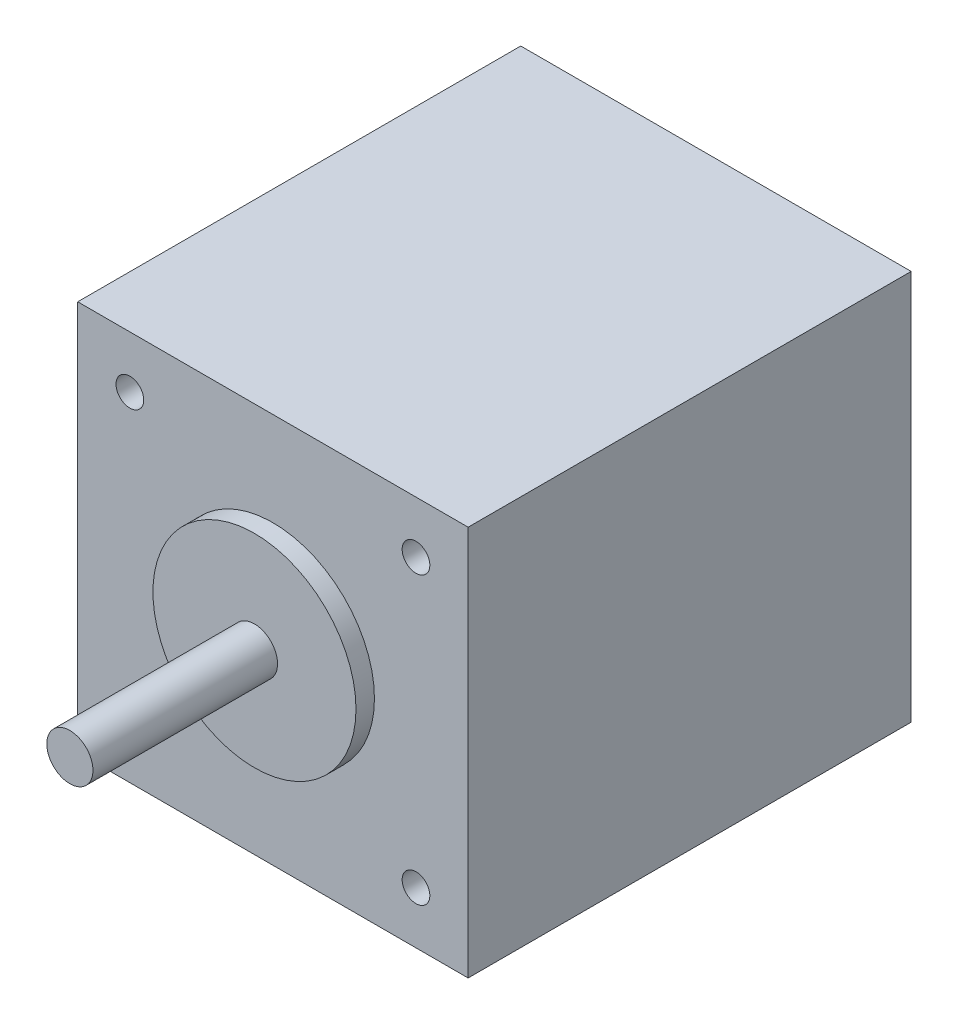
ISO-10303-21;
HEADER;
FILE_DESCRIPTION(('STEP AP214'),'2;1');
FILE_NAME('part.step','',(''),(''),'','','');
FILE_SCHEMA(('AUTOMOTIVE_DESIGN { 1 0 10303 214 1 1 1 1 }'));
ENDSEC;
DATA;
#1=APPLICATION_CONTEXT('core data for automotive mechanical design processes');
#2=APPLICATION_PROTOCOL_DEFINITION('international standard','automotive_design',2000,#1);
#3=PRODUCT_CONTEXT('',#1,'mechanical');
#4=PRODUCT('Part','Part','',(#3));
#5=PRODUCT_RELATED_PRODUCT_CATEGORY('part','',(#4));
#6=PRODUCT_DEFINITION_FORMATION('','',#4);
#7=PRODUCT_DEFINITION_CONTEXT('part definition',#1,'design');
#8=PRODUCT_DEFINITION('design','',#6,#7);
#9=PRODUCT_DEFINITION_SHAPE('','',#8);
#10=(LENGTH_UNIT() NAMED_UNIT(*) SI_UNIT(.MILLI.,.METRE.));
#11=(NAMED_UNIT(*) PLANE_ANGLE_UNIT() SI_UNIT($,.RADIAN.));
#12=(NAMED_UNIT(*) SI_UNIT($,.STERADIAN.) SOLID_ANGLE_UNIT());
#13=UNCERTAINTY_MEASURE_WITH_UNIT(LENGTH_MEASURE(1.E-05),#10,'distance_accuracy_value','');
#14=(GEOMETRIC_REPRESENTATION_CONTEXT(3) GLOBAL_UNCERTAINTY_ASSIGNED_CONTEXT((#13)) GLOBAL_UNIT_ASSIGNED_CONTEXT((#10,
#11,#12)) REPRESENTATION_CONTEXT('',''));
#15=CARTESIAN_POINT('',(0.,0.,0.));
#16=DIRECTION('',(0.,0.,1.));
#17=DIRECTION('',(1.,0.,0.));
#18=AXIS2_PLACEMENT_3D('',#15,#16,#17);
#19=CARTESIAN_POINT('',(21.15,-21.15,48.));
#20=DIRECTION('',(-1.,0.,0.));
#21=DIRECTION('',(0.,0.,1.));
#22=AXIS2_PLACEMENT_3D('',#19,#20,#21);
#23=PLANE('',#22);
#24=DIRECTION('',(0.,1.,0.));
#25=VECTOR('',#24,1.);
#26=CARTESIAN_POINT('',(21.15,-21.15,0.));
#27=LINE('',#26,#25);
#28=CARTESIAN_POINT('',(21.15,-21.15,0.));
#29=VERTEX_POINT('',#28);
#30=CARTESIAN_POINT('',(21.15,21.15,0.));
#31=VERTEX_POINT('',#30);
#32=EDGE_CURVE('E109',#29,#31,#27,.T.);
#33=ORIENTED_EDGE('',*,*,#32,.T.);
#34=DIRECTION('',(0.,0.,-1.));
#35=VECTOR('',#34,1.);
#36=CARTESIAN_POINT('',(21.15,21.15,48.));
#37=LINE('',#36,#35);
#38=CARTESIAN_POINT('',(21.15,21.15,48.));
#39=VERTEX_POINT('',#38);
#40=EDGE_CURVE('E38',#39,#31,#37,.T.);
#41=ORIENTED_EDGE('',*,*,#40,.F.);
#42=DIRECTION('',(0.,1.,0.));
#43=VECTOR('',#42,1.);
#44=CARTESIAN_POINT('',(21.15,-21.15,48.));
#45=LINE('',#44,#43);
#46=CARTESIAN_POINT('',(21.15,-21.15,48.));
#47=VERTEX_POINT('',#46);
#48=EDGE_CURVE('E90',#47,#39,#45,.T.);
#49=ORIENTED_EDGE('',*,*,#48,.F.);
#50=DIRECTION('',(0.,0.,-1.));
#51=VECTOR('',#50,1.);
#52=CARTESIAN_POINT('',(21.15,-21.15,48.));
#53=LINE('',#52,#51);
#54=EDGE_CURVE('E105',#47,#29,#53,.T.);
#55=ORIENTED_EDGE('',*,*,#54,.T.);
#56=EDGE_LOOP('',(#33,#41,#49,#55));
#57=FACE_BOUND('',#56,.T.);
#58=ADVANCED_FACE('F35',(#57),#23,.F.);
#59=CARTESIAN_POINT('',(-21.15,21.15,48.));
#60=DIRECTION('',(0.,-1.,0.));
#61=DIRECTION('',(0.,0.,-1.));
#62=AXIS2_PLACEMENT_3D('',#59,#60,#61);
#63=PLANE('',#62);
#64=DIRECTION('',(-1.,0.,0.));
#65=VECTOR('',#64,1.);
#66=CARTESIAN_POINT('',(-21.15,21.15,0.));
#67=LINE('',#66,#65);
#68=CARTESIAN_POINT('',(-21.15,21.15,0.));
#69=VERTEX_POINT('',#68);
#70=EDGE_CURVE('E96',#31,#69,#67,.T.);
#71=ORIENTED_EDGE('',*,*,#70,.T.);
#72=DIRECTION('',(0.,0.,-1.));
#73=VECTOR('',#72,1.);
#74=CARTESIAN_POINT('',(-21.15,21.15,48.));
#75=LINE('',#74,#73);
#76=CARTESIAN_POINT('',(-21.15,21.15,48.));
#77=VERTEX_POINT('',#76);
#78=EDGE_CURVE('E94',#77,#69,#75,.T.);
#79=ORIENTED_EDGE('',*,*,#78,.F.);
#80=DIRECTION('',(-1.,0.,0.));
#81=VECTOR('',#80,1.);
#82=CARTESIAN_POINT('',(-21.15,21.15,48.));
#83=LINE('',#82,#81);
#84=EDGE_CURVE('E85',#39,#77,#83,.T.);
#85=ORIENTED_EDGE('',*,*,#84,.F.);
#86=ORIENTED_EDGE('',*,*,#40,.T.);
#87=EDGE_LOOP('',(#71,#79,#85,#86));
#88=FACE_BOUND('',#87,.T.);
#89=ADVANCED_FACE('F95',(#88),#63,.F.);
#90=CARTESIAN_POINT('',(-21.15,-21.15,48.));
#91=DIRECTION('',(1.,0.,0.));
#92=DIRECTION('',(0.,0.,-1.));
#93=AXIS2_PLACEMENT_3D('',#90,#91,#92);
#94=PLANE('',#93);
#95=DIRECTION('',(0.,-1.,0.));
#96=VECTOR('',#95,1.);
#97=CARTESIAN_POINT('',(-21.15,-21.15,0.));
#98=LINE('',#97,#96);
#99=CARTESIAN_POINT('',(-21.15,-21.15,0.));
#100=VERTEX_POINT('',#99);
#101=EDGE_CURVE('E71',#69,#100,#98,.T.);
#102=ORIENTED_EDGE('',*,*,#101,.T.);
#103=DIRECTION('',(0.,0.,-1.));
#104=VECTOR('',#103,1.);
#105=CARTESIAN_POINT('',(-21.15,-21.15,48.));
#106=LINE('',#105,#104);
#107=CARTESIAN_POINT('',(-21.15,-21.15,48.));
#108=VERTEX_POINT('',#107);
#109=EDGE_CURVE('E98',#108,#100,#106,.T.);
#110=ORIENTED_EDGE('',*,*,#109,.F.);
#111=DIRECTION('',(0.,-1.,0.));
#112=VECTOR('',#111,1.);
#113=CARTESIAN_POINT('',(-21.15,-21.15,48.));
#114=LINE('',#113,#112);
#115=EDGE_CURVE('E88',#77,#108,#114,.T.);
#116=ORIENTED_EDGE('',*,*,#115,.F.);
#117=ORIENTED_EDGE('',*,*,#78,.T.);
#118=EDGE_LOOP('',(#102,#110,#116,#117));
#119=FACE_BOUND('',#118,.T.);
#120=ADVANCED_FACE('F99',(#119),#94,.F.);
#121=CARTESIAN_POINT('',(-21.15,-21.15,48.));
#122=DIRECTION('',(0.,1.,0.));
#123=DIRECTION('',(0.,0.,1.));
#124=AXIS2_PLACEMENT_3D('',#121,#122,#123);
#125=PLANE('',#124);
#126=DIRECTION('',(1.,0.,0.));
#127=VECTOR('',#126,1.);
#128=CARTESIAN_POINT('',(-21.15,-21.15,0.));
#129=LINE('',#128,#127);
#130=EDGE_CURVE('E77',#100,#29,#129,.T.);
#131=ORIENTED_EDGE('',*,*,#130,.T.);
#132=ORIENTED_EDGE('',*,*,#54,.F.);
#133=DIRECTION('',(1.,0.,0.));
#134=VECTOR('',#133,1.);
#135=CARTESIAN_POINT('',(-21.15,-21.15,48.));
#136=LINE('',#135,#134);
#137=EDGE_CURVE('E54',#108,#47,#136,.T.);
#138=ORIENTED_EDGE('',*,*,#137,.F.);
#139=ORIENTED_EDGE('',*,*,#109,.T.);
#140=EDGE_LOOP('',(#131,#132,#138,#139));
#141=FACE_BOUND('',#140,.T.);
#142=ADVANCED_FACE('F121',(#141),#125,.F.);
#143=CARTESIAN_POINT('',(0.,0.,48.));
#144=DIRECTION('',(0.,0.,-1.));
#145=DIRECTION('',(-1.,0.,0.));
#146=AXIS2_PLACEMENT_3D('',#143,#144,#145);
#147=PLANE('',#146);
#148=CARTESIAN_POINT('',(-15.5,-15.5,48.));
#149=DIRECTION('',(0.,0.,1.));
#150=DIRECTION('',(1.,0.,0.));
#151=AXIS2_PLACEMENT_3D('',#148,#149,#150);
#152=CIRCLE('',#151,1.5);
#153=CARTESIAN_POINT('',(-14.,-15.5,48.));
#154=VERTEX_POINT('',#153);
#155=EDGE_CURVE('E146',#154,#154,#152,.T.);
#156=ORIENTED_EDGE('',*,*,#155,.F.);
#157=EDGE_LOOP('',(#156));
#158=FACE_BOUND('',#157,.T.);
#159=CARTESIAN_POINT('',(15.5,-15.5,48.));
#160=DIRECTION('',(0.,0.,1.));
#161=DIRECTION('',(1.,0.,0.));
#162=AXIS2_PLACEMENT_3D('',#159,#160,#161);
#163=CIRCLE('',#162,1.5);
#164=CARTESIAN_POINT('',(17.,-15.5,48.));
#165=VERTEX_POINT('',#164);
#166=EDGE_CURVE('E153',#165,#165,#163,.T.);
#167=ORIENTED_EDGE('',*,*,#166,.F.);
#168=EDGE_LOOP('',(#167));
#169=FACE_BOUND('',#168,.T.);
#170=CARTESIAN_POINT('',(15.5,15.5,48.));
#171=DIRECTION('',(0.,0.,1.));
#172=DIRECTION('',(1.,0.,0.));
#173=AXIS2_PLACEMENT_3D('',#170,#171,#172);
#174=CIRCLE('',#173,1.5);
#175=CARTESIAN_POINT('',(17.,15.5,48.));
#176=VERTEX_POINT('',#175);
#177=EDGE_CURVE('E160',#176,#176,#174,.T.);
#178=ORIENTED_EDGE('',*,*,#177,.F.);
#179=EDGE_LOOP('',(#178));
#180=FACE_BOUND('',#179,.T.);
#181=CARTESIAN_POINT('',(-15.5,15.5,48.));
#182=DIRECTION('',(0.,0.,1.));
#183=DIRECTION('',(1.,0.,0.));
#184=AXIS2_PLACEMENT_3D('',#181,#182,#183);
#185=CIRCLE('',#184,1.5);
#186=CARTESIAN_POINT('',(-14.,15.5,48.));
#187=VERTEX_POINT('',#186);
#188=EDGE_CURVE('E140',#187,#187,#185,.T.);
#189=ORIENTED_EDGE('',*,*,#188,.F.);
#190=EDGE_LOOP('',(#189));
#191=FACE_BOUND('',#190,.T.);
#192=CARTESIAN_POINT('',(0.,0.,48.));
#193=DIRECTION('',(0.,0.,1.));
#194=DIRECTION('',(1.,0.,0.));
#195=AXIS2_PLACEMENT_3D('',#192,#193,#194);
#196=CIRCLE('',#195,11.);
#197=CARTESIAN_POINT('',(11.,0.,48.));
#198=VERTEX_POINT('',#197);
#199=EDGE_CURVE('E45',#198,#198,#196,.T.);
#200=ORIENTED_EDGE('',*,*,#199,.F.);
#201=EDGE_LOOP('',(#200));
#202=FACE_BOUND('',#201,.T.);
#203=ORIENTED_EDGE('',*,*,#48,.T.);
#204=ORIENTED_EDGE('',*,*,#84,.T.);
#205=ORIENTED_EDGE('',*,*,#115,.T.);
#206=ORIENTED_EDGE('',*,*,#137,.T.);
#207=EDGE_LOOP('',(#203,#204,#205,#206));
#208=FACE_BOUND('',#207,.T.);
#209=ADVANCED_FACE('F86',(#158,#169,#180,#191,#202,#208),#147,.F.);
#210=CARTESIAN_POINT('',(0.,0.,0.));
#211=DIRECTION('',(0.,0.,-1.));
#212=DIRECTION('',(-1.,0.,0.));
#213=AXIS2_PLACEMENT_3D('',#210,#211,#212);
#214=PLANE('',#213);
#215=ORIENTED_EDGE('',*,*,#32,.F.);
#216=ORIENTED_EDGE('',*,*,#130,.F.);
#217=ORIENTED_EDGE('',*,*,#101,.F.);
#218=ORIENTED_EDGE('',*,*,#70,.F.);
#219=EDGE_LOOP('',(#215,#216,#217,#218));
#220=FACE_BOUND('',#219,.T.);
#221=ADVANCED_FACE('F124',(#220),#214,.T.);
#222=CARTESIAN_POINT('',(0.,0.,50.));
#223=DIRECTION('',(0.,0.,-1.));
#224=DIRECTION('',(-1.,0.,0.));
#225=AXIS2_PLACEMENT_3D('',#222,#223,#224);
#226=CYLINDRICAL_SURFACE('',#225,11.);
#227=CARTESIAN_POINT('',(0.,0.,50.));
#228=DIRECTION('',(0.,0.,1.));
#229=DIRECTION('',(1.,0.,0.));
#230=AXIS2_PLACEMENT_3D('',#227,#228,#229);
#231=CIRCLE('',#230,11.);
#232=CARTESIAN_POINT('',(11.,0.,50.));
#233=VERTEX_POINT('',#232);
#234=EDGE_CURVE('E113',#233,#233,#231,.T.);
#235=ORIENTED_EDGE('',*,*,#234,.F.);
#236=EDGE_LOOP('',(#235));
#237=FACE_BOUND('',#236,.T.);
#238=ORIENTED_EDGE('',*,*,#199,.T.);
#239=EDGE_LOOP('',(#238));
#240=FACE_BOUND('',#239,.T.);
#241=ADVANCED_FACE('F183',(#237,#240),#226,.T.);
#242=CARTESIAN_POINT('',(0.,0.,50.));
#243=DIRECTION('',(0.,0.,1.));
#244=DIRECTION('',(1.,0.,0.));
#245=AXIS2_PLACEMENT_3D('',#242,#243,#244);
#246=PLANE('',#245);
#247=CARTESIAN_POINT('',(0.,0.,50.));
#248=DIRECTION('',(0.,0.,1.));
#249=DIRECTION('',(1.,0.,0.));
#250=AXIS2_PLACEMENT_3D('',#247,#248,#249);
#251=CIRCLE('',#250,2.5);
#252=CARTESIAN_POINT('',(2.5,0.,50.));
#253=VERTEX_POINT('',#252);
#254=EDGE_CURVE('E11',#253,#253,#251,.T.);
#255=ORIENTED_EDGE('',*,*,#254,.F.);
#256=EDGE_LOOP('',(#255));
#257=FACE_BOUND('',#256,.T.);
#258=ORIENTED_EDGE('',*,*,#234,.T.);
#259=EDGE_LOOP('',(#258));
#260=FACE_BOUND('',#259,.T.);
#261=ADVANCED_FACE('F185',(#257,#260),#246,.T.);
#262=CARTESIAN_POINT('',(0.,0.,70.));
#263=DIRECTION('',(0.,0.,-1.));
#264=DIRECTION('',(-1.,0.,0.));
#265=AXIS2_PLACEMENT_3D('',#262,#263,#264);
#266=CYLINDRICAL_SURFACE('',#265,2.5);
#267=CARTESIAN_POINT('',(0.,0.,70.));
#268=DIRECTION('',(0.,0.,1.));
#269=DIRECTION('',(1.,0.,0.));
#270=AXIS2_PLACEMENT_3D('',#267,#268,#269);
#271=CIRCLE('',#270,2.5);
#272=CARTESIAN_POINT('',(2.5,0.,70.));
#273=VERTEX_POINT('',#272);
#274=EDGE_CURVE('E134',#273,#273,#271,.T.);
#275=ORIENTED_EDGE('',*,*,#274,.F.);
#276=EDGE_LOOP('',(#275));
#277=FACE_BOUND('',#276,.T.);
#278=ORIENTED_EDGE('',*,*,#254,.T.);
#279=EDGE_LOOP('',(#278));
#280=FACE_BOUND('',#279,.T.);
#281=ADVANCED_FACE('F192',(#277,#280),#266,.T.);
#282=CARTESIAN_POINT('',(0.,0.,70.));
#283=DIRECTION('',(0.,0.,1.));
#284=DIRECTION('',(1.,0.,0.));
#285=AXIS2_PLACEMENT_3D('',#282,#283,#284);
#286=PLANE('',#285);
#287=ORIENTED_EDGE('',*,*,#274,.T.);
#288=EDGE_LOOP('',(#287));
#289=FACE_BOUND('',#288,.T.);
#290=ADVANCED_FACE('F230',(#289),#286,.T.);
#291=CARTESIAN_POINT('',(-15.5,15.5,44.));
#292=DIRECTION('',(0.,0.,1.));
#293=DIRECTION('',(1.,0.,0.));
#294=AXIS2_PLACEMENT_3D('',#291,#292,#293);
#295=CYLINDRICAL_SURFACE('',#294,1.5);
#296=CARTESIAN_POINT('',(-15.5,15.5,44.));
#297=DIRECTION('',(0.,0.,1.));
#298=DIRECTION('',(1.,0.,0.));
#299=AXIS2_PLACEMENT_3D('',#296,#297,#298);
#300=CIRCLE('',#299,1.5);
#301=CARTESIAN_POINT('',(-14.,15.5,44.));
#302=VERTEX_POINT('',#301);
#303=EDGE_CURVE('E139',#302,#302,#300,.T.);
#304=ORIENTED_EDGE('',*,*,#303,.F.);
#305=EDGE_LOOP('',(#304));
#306=FACE_BOUND('',#305,.T.);
#307=ORIENTED_EDGE('',*,*,#188,.T.);
#308=EDGE_LOOP('',(#307));
#309=FACE_BOUND('',#308,.T.);
#310=ADVANCED_FACE('F244',(#306,#309),#295,.F.);
#311=CARTESIAN_POINT('',(-15.5,15.5,44.));
#312=DIRECTION('',(0.,0.,1.));
#313=DIRECTION('',(1.,0.,0.));
#314=AXIS2_PLACEMENT_3D('',#311,#312,#313);
#315=PLANE('',#314);
#316=ORIENTED_EDGE('',*,*,#303,.T.);
#317=EDGE_LOOP('',(#316));
#318=FACE_BOUND('',#317,.T.);
#319=ADVANCED_FACE('F171',(#318),#315,.T.);
#320=CARTESIAN_POINT('',(15.5,15.5,44.));
#321=DIRECTION('',(0.,0.,1.));
#322=DIRECTION('',(1.,0.,0.));
#323=AXIS2_PLACEMENT_3D('',#320,#321,#322);
#324=CYLINDRICAL_SURFACE('',#323,1.5);
#325=CARTESIAN_POINT('',(15.5,15.5,44.));
#326=DIRECTION('',(0.,0.,1.));
#327=DIRECTION('',(1.,0.,0.));
#328=AXIS2_PLACEMENT_3D('',#325,#326,#327);
#329=CIRCLE('',#328,1.5);
#330=CARTESIAN_POINT('',(17.,15.5,44.));
#331=VERTEX_POINT('',#330);
#332=EDGE_CURVE('E143',#331,#331,#329,.T.);
#333=ORIENTED_EDGE('',*,*,#332,.F.);
#334=EDGE_LOOP('',(#333));
#335=FACE_BOUND('',#334,.T.);
#336=ORIENTED_EDGE('',*,*,#177,.T.);
#337=EDGE_LOOP('',(#336));
#338=FACE_BOUND('',#337,.T.);
#339=ADVANCED_FACE('F168',(#335,#338),#324,.F.);
#340=CARTESIAN_POINT('',(15.5,15.5,44.));
#341=DIRECTION('',(0.,0.,1.));
#342=DIRECTION('',(1.,0.,0.));
#343=AXIS2_PLACEMENT_3D('',#340,#341,#342);
#344=PLANE('',#343);
#345=ORIENTED_EDGE('',*,*,#332,.T.);
#346=EDGE_LOOP('',(#345));
#347=FACE_BOUND('',#346,.T.);
#348=ADVANCED_FACE('F166',(#347),#344,.T.);
#349=CARTESIAN_POINT('',(15.5,-15.5,44.));
#350=DIRECTION('',(0.,0.,1.));
#351=DIRECTION('',(1.,0.,0.));
#352=AXIS2_PLACEMENT_3D('',#349,#350,#351);
#353=CYLINDRICAL_SURFACE('',#352,1.5);
#354=CARTESIAN_POINT('',(15.5,-15.5,44.));
#355=DIRECTION('',(0.,0.,1.));
#356=DIRECTION('',(1.,0.,0.));
#357=AXIS2_PLACEMENT_3D('',#354,#355,#356);
#358=CIRCLE('',#357,1.5);
#359=CARTESIAN_POINT('',(17.,-15.5,44.));
#360=VERTEX_POINT('',#359);
#361=EDGE_CURVE('E157',#360,#360,#358,.T.);
#362=ORIENTED_EDGE('',*,*,#361,.F.);
#363=EDGE_LOOP('',(#362));
#364=FACE_BOUND('',#363,.T.);
#365=ORIENTED_EDGE('',*,*,#166,.T.);
#366=EDGE_LOOP('',(#365));
#367=FACE_BOUND('',#366,.T.);
#368=ADVANCED_FACE('F270',(#364,#367),#353,.F.);
#369=CARTESIAN_POINT('',(15.5,-15.5,44.));
#370=DIRECTION('',(0.,0.,1.));
#371=DIRECTION('',(1.,0.,0.));
#372=AXIS2_PLACEMENT_3D('',#369,#370,#371);
#373=PLANE('',#372);
#374=ORIENTED_EDGE('',*,*,#361,.T.);
#375=EDGE_LOOP('',(#374));
#376=FACE_BOUND('',#375,.T.);
#377=ADVANCED_FACE('F278',(#376),#373,.T.);
#378=CARTESIAN_POINT('',(-15.5,-15.5,44.));
#379=DIRECTION('',(0.,0.,1.));
#380=DIRECTION('',(1.,0.,0.));
#381=AXIS2_PLACEMENT_3D('',#378,#379,#380);
#382=CYLINDRICAL_SURFACE('',#381,1.5);
#383=CARTESIAN_POINT('',(-15.5,-15.5,44.));
#384=DIRECTION('',(0.,0.,1.));
#385=DIRECTION('',(1.,0.,0.));
#386=AXIS2_PLACEMENT_3D('',#383,#384,#385);
#387=CIRCLE('',#386,1.5);
#388=CARTESIAN_POINT('',(-14.,-15.5,44.));
#389=VERTEX_POINT('',#388);
#390=EDGE_CURVE('E149',#389,#389,#387,.T.);
#391=ORIENTED_EDGE('',*,*,#390,.F.);
#392=EDGE_LOOP('',(#391));
#393=FACE_BOUND('',#392,.T.);
#394=ORIENTED_EDGE('',*,*,#155,.T.);
#395=EDGE_LOOP('',(#394));
#396=FACE_BOUND('',#395,.T.);
#397=ADVANCED_FACE('F285',(#393,#396),#382,.F.);
#398=CARTESIAN_POINT('',(-15.5,-15.5,44.));
#399=DIRECTION('',(0.,0.,1.));
#400=DIRECTION('',(1.,0.,0.));
#401=AXIS2_PLACEMENT_3D('',#398,#399,#400);
#402=PLANE('',#401);
#403=ORIENTED_EDGE('',*,*,#390,.T.);
#404=EDGE_LOOP('',(#403));
#405=FACE_BOUND('',#404,.T.);
#406=ADVANCED_FACE('F293',(#405),#402,.T.);
#407=CLOSED_SHELL('',(#58,#89,#120,#142,#209,#221,#241,#261,#281,#290,#310,#319,#339,#348,#368,
#377,#397,#406));
#408=MANIFOLD_SOLID_BREP('B2',#407);
#409=ADVANCED_BREP_SHAPE_REPRESENTATION('',(#18,#408),#14);
#410=SHAPE_DEFINITION_REPRESENTATION(#9,#409);
ENDSEC;
END-ISO-10303-21;
